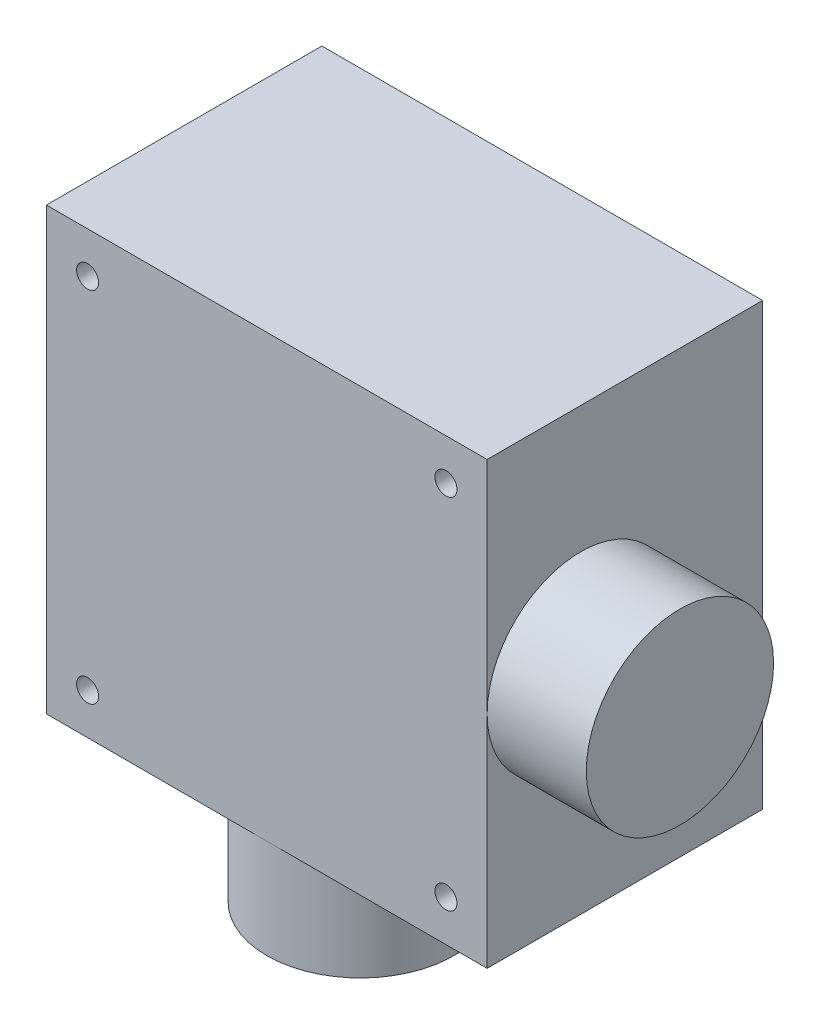
ISO-10303-21;
HEADER;
FILE_DESCRIPTION(('STEP AP214'),'2;1');
FILE_NAME('part.step','',(''),(''),'','','');
FILE_SCHEMA(('AUTOMOTIVE_DESIGN { 1 0 10303 214 1 1 1 1 }'));
ENDSEC;
DATA;
#1=APPLICATION_CONTEXT('core data for automotive mechanical design processes');
#2=APPLICATION_PROTOCOL_DEFINITION('international standard','automotive_design',2000,#1);
#3=PRODUCT_CONTEXT('',#1,'mechanical');
#4=PRODUCT('Part','Part','',(#3));
#5=PRODUCT_RELATED_PRODUCT_CATEGORY('part','',(#4));
#6=PRODUCT_DEFINITION_FORMATION('','',#4);
#7=PRODUCT_DEFINITION_CONTEXT('part definition',#1,'design');
#8=PRODUCT_DEFINITION('design','',#6,#7);
#9=PRODUCT_DEFINITION_SHAPE('','',#8);
#10=(LENGTH_UNIT() NAMED_UNIT(*) SI_UNIT(.MILLI.,.METRE.));
#11=(NAMED_UNIT(*) PLANE_ANGLE_UNIT() SI_UNIT($,.RADIAN.));
#12=(NAMED_UNIT(*) SI_UNIT($,.STERADIAN.) SOLID_ANGLE_UNIT());
#13=UNCERTAINTY_MEASURE_WITH_UNIT(LENGTH_MEASURE(1.E-05),#10,'distance_accuracy_value','');
#14=(GEOMETRIC_REPRESENTATION_CONTEXT(3) GLOBAL_UNCERTAINTY_ASSIGNED_CONTEXT((#13)) GLOBAL_UNIT_ASSIGNED_CONTEXT((#10,
#11,#12)) REPRESENTATION_CONTEXT('',''));
#15=CARTESIAN_POINT('',(0.,0.,0.));
#16=DIRECTION('',(0.,0.,1.));
#17=DIRECTION('',(1.,0.,0.));
#18=AXIS2_PLACEMENT_3D('',#15,#16,#17);
#19=CARTESIAN_POINT('',(-20.,20.,25.));
#20=DIRECTION('',(1.,0.,0.));
#21=DIRECTION('',(0.,1.,0.));
#22=AXIS2_PLACEMENT_3D('',#19,#20,#21);
#23=PLANE('',#22);
#24=DIRECTION('',(0.,-1.,0.));
#25=VECTOR('',#24,1.);
#26=CARTESIAN_POINT('',(-20.,20.,0.));
#27=LINE('',#26,#25);
#28=CARTESIAN_POINT('',(-20.,20.,0.));
#29=VERTEX_POINT('',#28);
#30=CARTESIAN_POINT('',(-20.,-20.,0.));
#31=VERTEX_POINT('',#30);
#32=EDGE_CURVE('E118',#29,#31,#27,.T.);
#33=ORIENTED_EDGE('',*,*,#32,.T.);
#34=DIRECTION('',(0.,0.,-1.));
#35=VECTOR('',#34,1.);
#36=CARTESIAN_POINT('',(-20.,-20.,25.));
#37=LINE('',#36,#35);
#38=CARTESIAN_POINT('',(-20.,-20.,25.));
#39=VERTEX_POINT('',#38);
#40=EDGE_CURVE('E11',#39,#31,#37,.T.);
#41=ORIENTED_EDGE('',*,*,#40,.F.);
#42=DIRECTION('',(0.,-1.,0.));
#43=VECTOR('',#42,1.);
#44=CARTESIAN_POINT('',(-20.,20.,25.));
#45=LINE('',#44,#43);
#46=CARTESIAN_POINT('',(-20.,20.,25.));
#47=VERTEX_POINT('',#46);
#48=EDGE_CURVE('E100',#47,#39,#45,.T.);
#49=ORIENTED_EDGE('',*,*,#48,.F.);
#50=DIRECTION('',(0.,0.,-1.));
#51=VECTOR('',#50,1.);
#52=CARTESIAN_POINT('',(-20.,20.,25.));
#53=LINE('',#52,#51);
#54=EDGE_CURVE('E117',#47,#29,#53,.T.);
#55=ORIENTED_EDGE('',*,*,#54,.T.);
#56=EDGE_LOOP('',(#33,#41,#49,#55));
#57=FACE_BOUND('',#56,.T.);
#58=ADVANCED_FACE('F40',(#57),#23,.F.);
#59=CARTESIAN_POINT('',(-20.,-20.,25.));
#60=DIRECTION('',(0.,1.,0.));
#61=DIRECTION('',(0.,0.,1.));
#62=AXIS2_PLACEMENT_3D('',#59,#60,#61);
#63=PLANE('',#62);
#64=DIRECTION('',(1.,0.,0.));
#65=VECTOR('',#64,1.);
#66=CARTESIAN_POINT('',(-20.,-20.,25.));
#67=LINE('',#66,#65);
#68=CARTESIAN_POINT('',(0.,-20.,25.));
#69=VERTEX_POINT('',#68);
#70=CARTESIAN_POINT('',(20.,-20.,25.));
#71=VERTEX_POINT('',#70);
#72=EDGE_CURVE('E97',#69,#71,#67,.T.);
#73=ORIENTED_EDGE('',*,*,#72,.F.);
#74=CARTESIAN_POINT('',(0.,-20.,16.5));
#75=DIRECTION('',(0.,-1.,0.));
#76=DIRECTION('',(0.,0.,-1.));
#77=AXIS2_PLACEMENT_3D('',#74,#75,#76);
#78=CIRCLE('',#77,8.5);
#79=EDGE_CURVE('E106',#69,#69,#78,.T.);
#80=ORIENTED_EDGE('',*,*,#79,.F.);
#81=EDGE_CURVE('E91',#39,#69,#67,.T.);
#82=ORIENTED_EDGE('',*,*,#81,.F.);
#83=ORIENTED_EDGE('',*,*,#40,.T.);
#84=DIRECTION('',(1.,0.,0.));
#85=VECTOR('',#84,1.);
#86=CARTESIAN_POINT('',(-20.,-20.,0.));
#87=LINE('',#86,#85);
#88=CARTESIAN_POINT('',(20.,-20.,0.));
#89=VERTEX_POINT('',#88);
#90=EDGE_CURVE('E122',#31,#89,#87,.T.);
#91=ORIENTED_EDGE('',*,*,#90,.T.);
#92=DIRECTION('',(0.,0.,-1.));
#93=VECTOR('',#92,1.);
#94=CARTESIAN_POINT('',(20.,-20.,25.));
#95=LINE('',#94,#93);
#96=EDGE_CURVE('E48',#71,#89,#95,.T.);
#97=ORIENTED_EDGE('',*,*,#96,.F.);
#98=EDGE_LOOP('',(#73,#80,#82,#83,#91,#97));
#99=FACE_BOUND('',#98,.T.);
#100=ADVANCED_FACE('F104',(#99),#63,.F.);
#101=CARTESIAN_POINT('',(20.,20.,25.));
#102=DIRECTION('',(-1.,0.,0.));
#103=DIRECTION('',(0.,-1.,0.));
#104=AXIS2_PLACEMENT_3D('',#101,#102,#103);
#105=PLANE('',#104);
#106=DIRECTION('',(0.,1.,0.));
#107=VECTOR('',#106,1.);
#108=CARTESIAN_POINT('',(20.,20.,25.));
#109=LINE('',#108,#107);
#110=CARTESIAN_POINT('',(20.,0.,25.));
#111=VERTEX_POINT('',#110);
#112=CARTESIAN_POINT('',(20.,20.,25.));
#113=VERTEX_POINT('',#112);
#114=EDGE_CURVE('E102',#111,#113,#109,.T.);
#115=ORIENTED_EDGE('',*,*,#114,.F.);
#116=CARTESIAN_POINT('',(20.,0.,16.5));
#117=DIRECTION('',(-1.,0.,0.));
#118=DIRECTION('',(0.,0.,-1.));
#119=AXIS2_PLACEMENT_3D('',#116,#117,#118);
#120=CIRCLE('',#119,8.5);
#121=EDGE_CURVE('E53',#111,#111,#120,.T.);
#122=ORIENTED_EDGE('',*,*,#121,.T.);
#123=EDGE_CURVE('E113',#71,#111,#109,.T.);
#124=ORIENTED_EDGE('',*,*,#123,.F.);
#125=ORIENTED_EDGE('',*,*,#96,.T.);
#126=DIRECTION('',(0.,1.,0.));
#127=VECTOR('',#126,1.);
#128=CARTESIAN_POINT('',(20.,20.,0.));
#129=LINE('',#128,#127);
#130=CARTESIAN_POINT('',(20.,20.,0.));
#131=VERTEX_POINT('',#130);
#132=EDGE_CURVE('E126',#89,#131,#129,.T.);
#133=ORIENTED_EDGE('',*,*,#132,.T.);
#134=DIRECTION('',(0.,0.,-1.));
#135=VECTOR('',#134,1.);
#136=CARTESIAN_POINT('',(20.,20.,25.));
#137=LINE('',#136,#135);
#138=EDGE_CURVE('E130',#113,#131,#137,.T.);
#139=ORIENTED_EDGE('',*,*,#138,.F.);
#140=EDGE_LOOP('',(#115,#122,#124,#125,#133,#139));
#141=FACE_BOUND('',#140,.T.);
#142=ADVANCED_FACE('F135',(#141),#105,.F.);
#143=CARTESIAN_POINT('',(-20.,20.,25.));
#144=DIRECTION('',(0.,-1.,0.));
#145=DIRECTION('',(0.,0.,-1.));
#146=AXIS2_PLACEMENT_3D('',#143,#144,#145);
#147=PLANE('',#146);
#148=DIRECTION('',(-1.,0.,0.));
#149=VECTOR('',#148,1.);
#150=CARTESIAN_POINT('',(-20.,20.,0.));
#151=LINE('',#150,#149);
#152=EDGE_CURVE('E84',#131,#29,#151,.T.);
#153=ORIENTED_EDGE('',*,*,#152,.T.);
#154=ORIENTED_EDGE('',*,*,#54,.F.);
#155=DIRECTION('',(-1.,0.,0.));
#156=VECTOR('',#155,1.);
#157=CARTESIAN_POINT('',(-20.,20.,25.));
#158=LINE('',#157,#156);
#159=EDGE_CURVE('E61',#113,#47,#158,.T.);
#160=ORIENTED_EDGE('',*,*,#159,.F.);
#161=ORIENTED_EDGE('',*,*,#138,.T.);
#162=EDGE_LOOP('',(#153,#154,#160,#161));
#163=FACE_BOUND('',#162,.T.);
#164=ADVANCED_FACE('F141',(#163),#147,.F.);
#165=CARTESIAN_POINT('',(0.,0.,25.));
#166=DIRECTION('',(0.,0.,1.));
#167=DIRECTION('',(1.,0.,0.));
#168=AXIS2_PLACEMENT_3D('',#165,#166,#167);
#169=PLANE('',#168);
#170=CARTESIAN_POINT('',(16.2634559672906,16.2634559672906,25.));
#171=DIRECTION('',(0.,0.,1.));
#172=DIRECTION('',(1.,0.,0.));
#173=AXIS2_PLACEMENT_3D('',#170,#171,#172);
#174=CIRCLE('',#173,1.);
#175=CARTESIAN_POINT('',(17.2634559672906,16.2634559672906,25.));
#176=VERTEX_POINT('',#175);
#177=EDGE_CURVE('E144',#176,#176,#174,.T.);
#178=ORIENTED_EDGE('',*,*,#177,.F.);
#179=EDGE_LOOP('',(#178));
#180=FACE_BOUND('',#179,.T.);
#181=CARTESIAN_POINT('',(-16.2634559672906,-16.2634559672906,25.));
#182=DIRECTION('',(0.,0.,1.));
#183=DIRECTION('',(1.,0.,0.));
#184=AXIS2_PLACEMENT_3D('',#181,#182,#183);
#185=CIRCLE('',#184,1.);
#186=CARTESIAN_POINT('',(-15.2634559672906,-16.2634559672906,25.));
#187=VERTEX_POINT('',#186);
#188=EDGE_CURVE('E157',#187,#187,#185,.T.);
#189=ORIENTED_EDGE('',*,*,#188,.F.);
#190=EDGE_LOOP('',(#189));
#191=FACE_BOUND('',#190,.T.);
#192=CARTESIAN_POINT('',(16.2634559672906,-16.2634559672906,25.));
#193=DIRECTION('',(0.,0.,1.));
#194=DIRECTION('',(1.,0.,0.));
#195=AXIS2_PLACEMENT_3D('',#192,#193,#194);
#196=CIRCLE('',#195,1.);
#197=CARTESIAN_POINT('',(17.2634559672906,-16.2634559672906,25.));
#198=VERTEX_POINT('',#197);
#199=EDGE_CURVE('E165',#198,#198,#196,.T.);
#200=ORIENTED_EDGE('',*,*,#199,.F.);
#201=EDGE_LOOP('',(#200));
#202=FACE_BOUND('',#201,.T.);
#203=CARTESIAN_POINT('',(-16.2634559672906,16.2634559672906,25.));
#204=DIRECTION('',(0.,0.,1.));
#205=DIRECTION('',(1.,0.,0.));
#206=AXIS2_PLACEMENT_3D('',#203,#204,#205);
#207=CIRCLE('',#206,1.);
#208=CARTESIAN_POINT('',(-15.2634559672906,16.2634559672906,25.));
#209=VERTEX_POINT('',#208);
#210=EDGE_CURVE('E153',#209,#209,#207,.T.);
#211=ORIENTED_EDGE('',*,*,#210,.F.);
#212=EDGE_LOOP('',(#211));
#213=FACE_BOUND('',#212,.T.);
#214=ORIENTED_EDGE('',*,*,#48,.T.);
#215=ORIENTED_EDGE('',*,*,#81,.T.);
#216=ORIENTED_EDGE('',*,*,#72,.T.);
#217=ORIENTED_EDGE('',*,*,#123,.T.);
#218=ORIENTED_EDGE('',*,*,#114,.T.);
#219=ORIENTED_EDGE('',*,*,#159,.T.);
#220=EDGE_LOOP('',(#214,#215,#216,#217,#218,#219));
#221=FACE_BOUND('',#220,.T.);
#222=ADVANCED_FACE('F95',(#180,#191,#202,#213,#221),#169,.T.);
#223=CARTESIAN_POINT('',(0.,0.,0.));
#224=DIRECTION('',(0.,0.,1.));
#225=DIRECTION('',(1.,0.,0.));
#226=AXIS2_PLACEMENT_3D('',#223,#224,#225);
#227=PLANE('',#226);
#228=ORIENTED_EDGE('',*,*,#32,.F.);
#229=ORIENTED_EDGE('',*,*,#152,.F.);
#230=ORIENTED_EDGE('',*,*,#132,.F.);
#231=ORIENTED_EDGE('',*,*,#90,.F.);
#232=EDGE_LOOP('',(#228,#229,#230,#231));
#233=FACE_BOUND('',#232,.T.);
#234=ADVANCED_FACE('F139',(#233),#227,.F.);
#235=CARTESIAN_POINT('',(0.,-29.,16.5));
#236=DIRECTION('',(0.,1.,0.));
#237=DIRECTION('',(0.,0.,1.));
#238=AXIS2_PLACEMENT_3D('',#235,#236,#237);
#239=CYLINDRICAL_SURFACE('',#238,8.5);
#240=CARTESIAN_POINT('',(0.,-29.,16.5));
#241=DIRECTION('',(0.,-1.,0.));
#242=DIRECTION('',(0.,0.,-1.));
#243=AXIS2_PLACEMENT_3D('',#240,#241,#242);
#244=CIRCLE('',#243,8.5);
#245=CARTESIAN_POINT('',(0.,-29.,8.));
#246=VERTEX_POINT('',#245);
#247=EDGE_CURVE('E123',#246,#246,#244,.T.);
#248=ORIENTED_EDGE('',*,*,#247,.F.);
#249=EDGE_LOOP('',(#248));
#250=FACE_BOUND('',#249,.T.);
#251=ORIENTED_EDGE('',*,*,#79,.T.);
#252=EDGE_LOOP('',(#251));
#253=FACE_BOUND('',#252,.T.);
#254=ADVANCED_FACE('F179',(#250,#253),#239,.T.);
#255=CARTESIAN_POINT('',(0.,-29.,16.5));
#256=DIRECTION('',(0.,-1.,0.));
#257=DIRECTION('',(0.,0.,-1.));
#258=AXIS2_PLACEMENT_3D('',#255,#256,#257);
#259=PLANE('',#258);
#260=ORIENTED_EDGE('',*,*,#247,.T.);
#261=EDGE_LOOP('',(#260));
#262=FACE_BOUND('',#261,.T.);
#263=ADVANCED_FACE('F181',(#262),#259,.T.);
#264=CARTESIAN_POINT('',(29.,0.,16.5));
#265=DIRECTION('',(-1.,0.,0.));
#266=DIRECTION('',(0.,-1.,0.));
#267=AXIS2_PLACEMENT_3D('',#264,#265,#266);
#268=CYLINDRICAL_SURFACE('',#267,8.5);
#269=CARTESIAN_POINT('',(29.,0.,16.5));
#270=DIRECTION('',(-1.,0.,0.));
#271=DIRECTION('',(0.,0.,-1.));
#272=AXIS2_PLACEMENT_3D('',#269,#270,#271);
#273=CIRCLE('',#272,8.5);
#274=CARTESIAN_POINT('',(29.,0.,8.));
#275=VERTEX_POINT('',#274);
#276=EDGE_CURVE('E173',#275,#275,#273,.T.);
#277=ORIENTED_EDGE('',*,*,#276,.T.);
#278=EDGE_LOOP('',(#277));
#279=FACE_BOUND('',#278,.T.);
#280=ORIENTED_EDGE('',*,*,#121,.F.);
#281=EDGE_LOOP('',(#280));
#282=FACE_BOUND('',#281,.T.);
#283=ADVANCED_FACE('F188',(#279,#282),#268,.T.);
#284=CARTESIAN_POINT('',(29.,0.,16.5));
#285=DIRECTION('',(1.,0.,0.));
#286=DIRECTION('',(0.,0.,-1.));
#287=AXIS2_PLACEMENT_3D('',#284,#285,#286);
#288=PLANE('',#287);
#289=ORIENTED_EDGE('',*,*,#276,.F.);
#290=EDGE_LOOP('',(#289));
#291=FACE_BOUND('',#290,.T.);
#292=ADVANCED_FACE('F218',(#291),#288,.T.);
#293=CARTESIAN_POINT('',(-16.2634559672906,16.2634559672906,15.));
#294=DIRECTION('',(0.,0.,1.));
#295=DIRECTION('',(1.,0.,0.));
#296=AXIS2_PLACEMENT_3D('',#293,#294,#295);
#297=CYLINDRICAL_SURFACE('',#296,1.);
#298=CARTESIAN_POINT('',(-16.2634559672906,16.2634559672906,15.));
#299=DIRECTION('',(0.,0.,1.));
#300=DIRECTION('',(1.,0.,0.));
#301=AXIS2_PLACEMENT_3D('',#298,#299,#300);
#302=CIRCLE('',#301,1.);
#303=CARTESIAN_POINT('',(-15.2634559672906,16.2634559672906,15.));
#304=VERTEX_POINT('',#303);
#305=EDGE_CURVE('E168',#304,#304,#302,.T.);
#306=ORIENTED_EDGE('',*,*,#305,.F.);
#307=EDGE_LOOP('',(#306));
#308=FACE_BOUND('',#307,.T.);
#309=ORIENTED_EDGE('',*,*,#210,.T.);
#310=EDGE_LOOP('',(#309));
#311=FACE_BOUND('',#310,.T.);
#312=ADVANCED_FACE('F215',(#308,#311),#297,.F.);
#313=CARTESIAN_POINT('',(-16.2634559672906,16.2634559672906,15.));
#314=DIRECTION('',(0.,0.,1.));
#315=DIRECTION('',(1.,0.,0.));
#316=AXIS2_PLACEMENT_3D('',#313,#314,#315);
#317=PLANE('',#316);
#318=ORIENTED_EDGE('',*,*,#305,.T.);
#319=EDGE_LOOP('',(#318));
#320=FACE_BOUND('',#319,.T.);
#321=ADVANCED_FACE('F217',(#320),#317,.T.);
#322=CARTESIAN_POINT('',(16.2634559672906,-16.2634559672906,15.));
#323=DIRECTION('',(0.,0.,1.));
#324=DIRECTION('',(1.,0.,0.));
#325=AXIS2_PLACEMENT_3D('',#322,#323,#324);
#326=CYLINDRICAL_SURFACE('',#325,1.);
#327=CARTESIAN_POINT('',(16.2634559672906,-16.2634559672906,15.));
#328=DIRECTION('',(0.,0.,1.));
#329=DIRECTION('',(1.,0.,0.));
#330=AXIS2_PLACEMENT_3D('',#327,#328,#329);
#331=CIRCLE('',#330,1.);
#332=CARTESIAN_POINT('',(17.2634559672906,-16.2634559672906,15.));
#333=VERTEX_POINT('',#332);
#334=EDGE_CURVE('E162',#333,#333,#331,.T.);
#335=ORIENTED_EDGE('',*,*,#334,.F.);
#336=EDGE_LOOP('',(#335));
#337=FACE_BOUND('',#336,.T.);
#338=ORIENTED_EDGE('',*,*,#199,.T.);
#339=EDGE_LOOP('',(#338));
#340=FACE_BOUND('',#339,.T.);
#341=ADVANCED_FACE('F225',(#337,#340),#326,.F.);
#342=CARTESIAN_POINT('',(16.2634559672906,-16.2634559672906,15.));
#343=DIRECTION('',(0.,0.,1.));
#344=DIRECTION('',(1.,0.,0.));
#345=AXIS2_PLACEMENT_3D('',#342,#343,#344);
#346=PLANE('',#345);
#347=ORIENTED_EDGE('',*,*,#334,.T.);
#348=EDGE_LOOP('',(#347));
#349=FACE_BOUND('',#348,.T.);
#350=ADVANCED_FACE('F270',(#349),#346,.T.);
#351=CARTESIAN_POINT('',(-16.2634559672906,-16.2634559672906,15.));
#352=DIRECTION('',(0.,0.,1.));
#353=DIRECTION('',(1.,0.,0.));
#354=AXIS2_PLACEMENT_3D('',#351,#352,#353);
#355=CYLINDRICAL_SURFACE('',#354,1.);
#356=CARTESIAN_POINT('',(-16.2634559672906,-16.2634559672906,15.));
#357=DIRECTION('',(0.,0.,1.));
#358=DIRECTION('',(1.,0.,0.));
#359=AXIS2_PLACEMENT_3D('',#356,#357,#358);
#360=CIRCLE('',#359,1.);
#361=CARTESIAN_POINT('',(-15.2634559672906,-16.2634559672906,15.));
#362=VERTEX_POINT('',#361);
#363=EDGE_CURVE('E147',#362,#362,#360,.T.);
#364=ORIENTED_EDGE('',*,*,#363,.F.);
#365=EDGE_LOOP('',(#364));
#366=FACE_BOUND('',#365,.T.);
#367=ORIENTED_EDGE('',*,*,#188,.T.);
#368=EDGE_LOOP('',(#367));
#369=FACE_BOUND('',#368,.T.);
#370=ADVANCED_FACE('F279',(#366,#369),#355,.F.);
#371=CARTESIAN_POINT('',(-16.2634559672906,-16.2634559672906,15.));
#372=DIRECTION('',(0.,0.,1.));
#373=DIRECTION('',(1.,0.,0.));
#374=AXIS2_PLACEMENT_3D('',#371,#372,#373);
#375=PLANE('',#374);
#376=ORIENTED_EDGE('',*,*,#363,.T.);
#377=EDGE_LOOP('',(#376));
#378=FACE_BOUND('',#377,.T.);
#379=ADVANCED_FACE('F289',(#378),#375,.T.);
#380=CARTESIAN_POINT('',(16.2634559672906,16.2634559672906,15.));
#381=DIRECTION('',(0.,0.,1.));
#382=DIRECTION('',(1.,0.,0.));
#383=AXIS2_PLACEMENT_3D('',#380,#381,#382);
#384=CYLINDRICAL_SURFACE('',#383,1.);
#385=CARTESIAN_POINT('',(16.2634559672906,16.2634559672906,15.));
#386=DIRECTION('',(0.,0.,1.));
#387=DIRECTION('',(1.,0.,0.));
#388=AXIS2_PLACEMENT_3D('',#385,#386,#387);
#389=CIRCLE('',#388,1.);
#390=CARTESIAN_POINT('',(17.2634559672906,16.2634559672906,15.));
#391=VERTEX_POINT('',#390);
#392=EDGE_CURVE('E146',#391,#391,#389,.T.);
#393=ORIENTED_EDGE('',*,*,#392,.F.);
#394=EDGE_LOOP('',(#393));
#395=FACE_BOUND('',#394,.T.);
#396=ORIENTED_EDGE('',*,*,#177,.T.);
#397=EDGE_LOOP('',(#396));
#398=FACE_BOUND('',#397,.T.);
#399=ADVANCED_FACE('F299',(#395,#398),#384,.F.);
#400=CARTESIAN_POINT('',(16.2634559672906,16.2634559672906,15.));
#401=DIRECTION('',(0.,0.,1.));
#402=DIRECTION('',(1.,0.,0.));
#403=AXIS2_PLACEMENT_3D('',#400,#401,#402);
#404=PLANE('',#403);
#405=ORIENTED_EDGE('',*,*,#392,.T.);
#406=EDGE_LOOP('',(#405));
#407=FACE_BOUND('',#406,.T.);
#408=ADVANCED_FACE('F309',(#407),#404,.T.);
#409=CLOSED_SHELL('',(#58,#100,#142,#164,#222,#234,#254,#263,#283,#292,#312,#321,#341,#350,#370,
#379,#399,#408));
#410=MANIFOLD_SOLID_BREP('B2',#409);
#411=ADVANCED_BREP_SHAPE_REPRESENTATION('',(#18,#410),#14);
#412=SHAPE_DEFINITION_REPRESENTATION(#9,#411);
ENDSEC;
END-ISO-10303-21;
